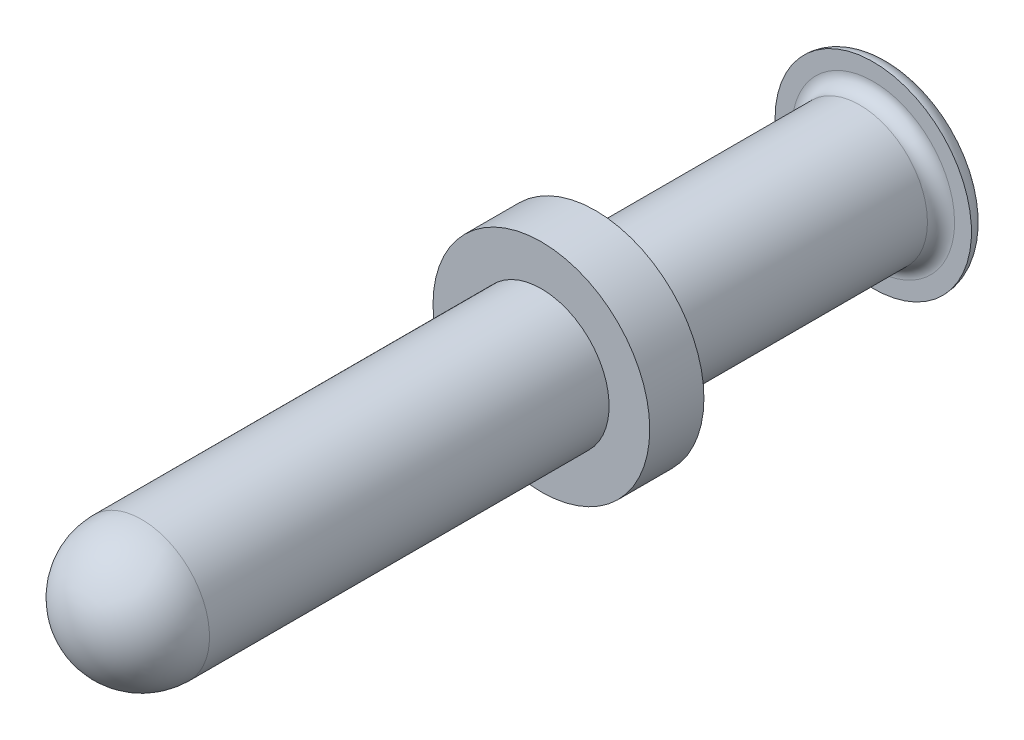
ISO-10303-21;
HEADER;
FILE_DESCRIPTION(('STEP AP214'),'2;1');
FILE_NAME('part.step','',(''),(''),'','','');
FILE_SCHEMA(('AUTOMOTIVE_DESIGN { 1 0 10303 214 1 1 1 1 }'));
ENDSEC;
DATA;
#1=APPLICATION_CONTEXT('core data for automotive mechanical design processes');
#2=APPLICATION_PROTOCOL_DEFINITION('international standard','automotive_design',2000,#1);
#3=PRODUCT_CONTEXT('',#1,'mechanical');
#4=PRODUCT('Part','Part','',(#3));
#5=PRODUCT_RELATED_PRODUCT_CATEGORY('part','',(#4));
#6=PRODUCT_DEFINITION_FORMATION('','',#4);
#7=PRODUCT_DEFINITION_CONTEXT('part definition',#1,'design');
#8=PRODUCT_DEFINITION('design','',#6,#7);
#9=PRODUCT_DEFINITION_SHAPE('','',#8);
#10=(LENGTH_UNIT() NAMED_UNIT(*) SI_UNIT(.MILLI.,.METRE.));
#11=(NAMED_UNIT(*) PLANE_ANGLE_UNIT() SI_UNIT($,.RADIAN.));
#12=(NAMED_UNIT(*) SI_UNIT($,.STERADIAN.) SOLID_ANGLE_UNIT());
#13=UNCERTAINTY_MEASURE_WITH_UNIT(LENGTH_MEASURE(1.E-05),#10,'distance_accuracy_value','');
#14=(GEOMETRIC_REPRESENTATION_CONTEXT(3) GLOBAL_UNCERTAINTY_ASSIGNED_CONTEXT((#13)) GLOBAL_UNIT_ASSIGNED_CONTEXT((#10,
#11,#12)) REPRESENTATION_CONTEXT('',''));
#15=CARTESIAN_POINT('',(0.,0.,0.));
#16=DIRECTION('',(0.,0.,1.));
#17=DIRECTION('',(1.,0.,0.));
#18=AXIS2_PLACEMENT_3D('',#15,#16,#17);
#19=CARTESIAN_POINT('',(0.,0.,-2.40000000002283));
#20=DIRECTION('',(0.,0.,-1.));
#21=DIRECTION('',(-1.,0.,0.));
#22=AXIS2_PLACEMENT_3D('',#19,#20,#21);
#23=CONICAL_SURFACE('',#22,0.749999999925421,1.05021549294806);
#24=CARTESIAN_POINT('',(5.6843418860808E-11,0.,-1.96999999971581));
#25=VERTEX_POINT('',#24);
#26=VERTEX_LOOP('',#25);
#27=FACE_BOUND('',#26,.T.);
#28=CARTESIAN_POINT('',(0.,0.,-2.4));
#29=DIRECTION('',(0.,0.,-1.));
#30=DIRECTION('',(-1.,0.,0.));
#31=AXIS2_PLACEMENT_3D('',#28,#29,#30);
#32=CIRCLE('',#31,0.75);
#33=CARTESIAN_POINT('',(-0.75,0.,-2.4));
#34=VERTEX_POINT('',#33);
#35=EDGE_CURVE('E44',#34,#34,#32,.T.);
#36=ORIENTED_EDGE('',*,*,#35,.T.);
#37=EDGE_LOOP('',(#36));
#38=FACE_BOUND('',#37,.T.);
#39=ADVANCED_FACE('F16',(#27,#38),#23,.F.);
#40=CARTESIAN_POINT('',(0.,0.,-3.9));
#41=DIRECTION('',(0.,0.,-1.));
#42=DIRECTION('',(-1.,0.,0.));
#43=AXIS2_PLACEMENT_3D('',#40,#41,#42);
#44=CYLINDRICAL_SURFACE('',#43,0.75);
#45=ORIENTED_EDGE('',*,*,#35,.F.);
#46=EDGE_LOOP('',(#45));
#47=FACE_BOUND('',#46,.T.);
#48=CARTESIAN_POINT('',(0.,0.,-3.9));
#49=DIRECTION('',(0.,0.,1.));
#50=DIRECTION('',(1.,0.,0.));
#51=AXIS2_PLACEMENT_3D('',#48,#49,#50);
#52=CIRCLE('',#51,0.75);
#53=CARTESIAN_POINT('',(0.75,0.,-3.9));
#54=VERTEX_POINT('',#53);
#55=EDGE_CURVE('E46',#54,#54,#52,.T.);
#56=ORIENTED_EDGE('',*,*,#55,.F.);
#57=EDGE_LOOP('',(#56));
#58=FACE_BOUND('',#57,.T.);
#59=ADVANCED_FACE('F40',(#47,#58),#44,.F.);
#60=CARTESIAN_POINT('',(0.,0.,-3.85000000000016));
#61=DIRECTION('',(0.,0.,1.));
#62=DIRECTION('',(1.,0.,0.));
#63=AXIS2_PLACEMENT_3D('',#60,#61,#62);
#64=TOROIDAL_SURFACE('',#63,1.24749371855334,0.500000000000079);
#65=CARTESIAN_POINT('',(0.,0.,-4.340910457157));
#66=DIRECTION('',(0.,0.,1.));
#67=DIRECTION('',(-1.,0.,0.));
#68=AXIS2_PLACEMENT_3D('',#65,#66,#67);
#69=CIRCLE('',#68,1.152588908063);
#70=CARTESIAN_POINT('',(-1.152588908063,0.,-4.340910457157));
#71=VERTEX_POINT('',#70);
#72=EDGE_CURVE('E49',#71,#71,#69,.T.);
#73=ORIENTED_EDGE('',*,*,#72,.F.);
#74=EDGE_LOOP('',(#73));
#75=FACE_BOUND('',#74,.T.);
#76=ORIENTED_EDGE('',*,*,#55,.T.);
#77=EDGE_LOOP('',(#76));
#78=FACE_BOUND('',#77,.T.);
#79=ADVANCED_FACE('F90',(#75,#78),#64,.T.);
#80=CARTESIAN_POINT('',(0.,0.,-4.09545522857772));
#81=DIRECTION('',(0.,0.,-1.));
#82=DIRECTION('',(-1.,0.,0.));
#83=AXIS2_PLACEMENT_3D('',#80,#81,#82);
#84=TOROIDAL_SURFACE('',#83,1.20004131330849,0.250000000000313);
#85=ORIENTED_EDGE('',*,*,#72,.T.);
#86=EDGE_LOOP('',(#85));
#87=FACE_BOUND('',#86,.T.);
#88=CARTESIAN_POINT('',(0.,0.,-4.10000000000001));
#89=DIRECTION('',(0.,0.,-1.));
#90=DIRECTION('',(-1.,0.,0.));
#91=AXIS2_PLACEMENT_3D('',#88,#89,#90);
#92=CIRCLE('',#91,1.45000000000066);
#93=CARTESIAN_POINT('',(-1.45000000000066,0.,-4.10000000000001));
#94=VERTEX_POINT('',#93);
#95=EDGE_CURVE('E20',#94,#94,#92,.T.);
#96=ORIENTED_EDGE('',*,*,#95,.T.);
#97=EDGE_LOOP('',(#96));
#98=FACE_BOUND('',#97,.T.);
#99=ADVANCED_FACE('F85',(#87,#98),#84,.T.);
#100=CARTESIAN_POINT('',(-1.2,0.,-4.1));
#101=DIRECTION('',(0.,0.,-1.));
#102=DIRECTION('',(-1.,0.,0.));
#103=AXIS2_PLACEMENT_3D('',#100,#101,#102);
#104=PLANE('',#103);
#105=CARTESIAN_POINT('',(1.2,0.,-4.1));
#106=CARTESIAN_POINT('',(1.2,0.228366044629868,-4.1));
#107=CARTESIAN_POINT('',(1.11574596127478,0.441713651474556,-4.1));
#108=CARTESIAN_POINT('',(1.0248346277536,0.671918823063507,-4.1));
#109=CARTESIAN_POINT('',(0.848528137423667,0.848528137423667,-4.1));
#110=CARTESIAN_POINT('',(0.673660893734094,1.02369573309341,-4.1));
#111=CARTESIAN_POINT('',(0.441713651474111,1.11574596127456,-4.1));
#112=CARTESIAN_POINT('',(0.229906911812743,1.19980326036621,-4.1));
#113=CARTESIAN_POINT('',(0.,1.20000000000033,-4.1));
#114=CARTESIAN_POINT('',(-0.227874939357829,1.20019500080236,-4.1));
#115=CARTESIAN_POINT('',(-0.441713651474444,1.11574596127511,-4.1));
#116=CARTESIAN_POINT('',(-0.671920707671893,1.02483274637664,-4.1));
#117=CARTESIAN_POINT('',(-0.848528137423667,0.848528137423667,-4.1));
#118=CARTESIAN_POINT('',(-1.02369573309332,0.673660893734214,-4.1));
#119=CARTESIAN_POINT('',(-1.11574596127456,0.441713651474111,-4.1));
#120=CARTESIAN_POINT('',(-1.2,0.229411169255753,-4.1));
#121=CARTESIAN_POINT('',(-1.2,0.,-4.1));
#122=B_SPLINE_CURVE_WITH_KNOTS('',2,(#105,#106,#107,#108,#109,#110,#111,#112,#113,#114,#115,
#116,#117,#118,#119,#120,#121),.UNSPECIFIED.,.F.,.F.,(3,2,2,2,2,2,2,2,3),(0.,0.125,0.25,0.375,
0.5,0.625,0.75,0.875,1.),.UNSPECIFIED.);
#123=CARTESIAN_POINT('',(-1.2,0.,-4.1));
#124=VERTEX_POINT('',#123);
#125=CARTESIAN_POINT('',(1.2,0.,-4.1));
#126=VERTEX_POINT('',#125);
#127=EDGE_CURVE('E67',#124,#126,#122,.F.);
#128=ORIENTED_EDGE('',*,*,#127,.T.);
#129=CARTESIAN_POINT('',(-1.2,0.,-4.1));
#130=CARTESIAN_POINT('',(-1.2,-0.228366044629746,-4.1));
#131=CARTESIAN_POINT('',(-1.11574596127478,-0.441713651474556,-4.1));
#132=CARTESIAN_POINT('',(-1.02483462775371,-0.671918823063378,-4.1));
#133=CARTESIAN_POINT('',(-0.848528137423667,-0.848528137423667,-4.1));
#134=CARTESIAN_POINT('',(-0.67366089373412,-1.02369573309341,-4.1));
#135=CARTESIAN_POINT('',(-0.441713651474111,-1.11574596127456,-4.1));
#136=CARTESIAN_POINT('',(-0.229906911812719,-1.19980326036621,-4.1));
#137=CARTESIAN_POINT('',(0.,-1.20000000000033,-4.1));
#138=CARTESIAN_POINT('',(0.227874939357877,-1.20019500080236,-4.1));
#139=CARTESIAN_POINT('',(0.441713651474444,-1.11574596127511,-4.1));
#140=CARTESIAN_POINT('',(0.671920707674766,-1.02483274637549,-4.1));
#141=CARTESIAN_POINT('',(0.848528137424333,-0.848528137423667,-4.1));
#142=CARTESIAN_POINT('',(1.02369573309357,-0.673660893733594,-4.1));
#143=CARTESIAN_POINT('',(1.11574596127456,-0.441713651474111,-4.1));
#144=CARTESIAN_POINT('',(1.2,-0.229411169255754,-4.1));
#145=CARTESIAN_POINT('',(1.2,0.,-4.1));
#146=B_SPLINE_CURVE_WITH_KNOTS('',2,(#129,#130,#131,#132,#133,#134,#135,#136,#137,#138,#139,
#140,#141,#142,#143,#144,#145),.UNSPECIFIED.,.F.,.F.,(3,2,2,2,2,2,2,2,3),(0.,0.125,0.25,0.375,
0.5,0.625,0.75,0.875,1.),.UNSPECIFIED.);
#147=EDGE_CURVE('E32',#126,#124,#146,.F.);
#148=ORIENTED_EDGE('',*,*,#147,.T.);
#149=EDGE_LOOP('',(#128,#148));
#150=FACE_BOUND('',#149,.T.);
#151=ORIENTED_EDGE('',*,*,#95,.F.);
#152=EDGE_LOOP('',(#151));
#153=FACE_BOUND('',#152,.T.);
#154=ADVANCED_FACE('F74',(#150,#153),#104,.F.);
#155=CARTESIAN_POINT('',(0.,0.,-3.9));
#156=DIRECTION('',(0.,0.,1.));
#157=DIRECTION('',(0.,-1.,0.));
#158=AXIS2_PLACEMENT_3D('',#155,#156,#157);
#159=TOROIDAL_SURFACE('',#158,1.2,0.2);
#160=ORIENTED_EDGE('',*,*,#147,.F.);
#161=ORIENTED_EDGE('',*,*,#127,.F.);
#162=EDGE_LOOP('',(#160,#161));
#163=FACE_BOUND('',#162,.T.);
#164=CARTESIAN_POINT('',(0.,0.,-3.9));
#165=DIRECTION('',(0.,0.,1.));
#166=DIRECTION('',(1.,0.,0.));
#167=AXIS2_PLACEMENT_3D('',#164,#165,#166);
#168=CIRCLE('',#167,1.);
#169=CARTESIAN_POINT('',(1.,0.,-3.9));
#170=VERTEX_POINT('',#169);
#171=EDGE_CURVE('E60',#170,#170,#168,.T.);
#172=ORIENTED_EDGE('',*,*,#171,.F.);
#173=EDGE_LOOP('',(#172));
#174=FACE_BOUND('',#173,.T.);
#175=ADVANCED_FACE('F84',(#163,#174),#159,.F.);
#176=CARTESIAN_POINT('',(0.,0.,-3.9));
#177=DIRECTION('',(0.,0.,1.));
#178=DIRECTION('',(1.,0.,0.));
#179=AXIS2_PLACEMENT_3D('',#176,#177,#178);
#180=CYLINDRICAL_SURFACE('',#179,1.);
#181=ORIENTED_EDGE('',*,*,#171,.T.);
#182=EDGE_LOOP('',(#181));
#183=FACE_BOUND('',#182,.T.);
#184=CARTESIAN_POINT('',(0.,0.,0.));
#185=DIRECTION('',(0.,0.,1.));
#186=DIRECTION('',(1.,0.,0.));
#187=AXIS2_PLACEMENT_3D('',#184,#185,#186);
#188=CIRCLE('',#187,1.);
#189=CARTESIAN_POINT('',(1.,0.,0.));
#190=VERTEX_POINT('',#189);
#191=EDGE_CURVE('E58',#190,#190,#188,.F.);
#192=ORIENTED_EDGE('',*,*,#191,.T.);
#193=EDGE_LOOP('',(#192));
#194=FACE_BOUND('',#193,.T.);
#195=ADVANCED_FACE('F86',(#183,#194),#180,.T.);
#196=CARTESIAN_POINT('',(0.,0.,0.));
#197=DIRECTION('',(0.,0.,1.));
#198=DIRECTION('',(1.,0.,0.));
#199=AXIS2_PLACEMENT_3D('',#196,#197,#198);
#200=PLANE('',#199);
#201=CARTESIAN_POINT('',(0.,0.,0.));
#202=DIRECTION('',(0.,0.,-1.));
#203=DIRECTION('',(-1.,0.,0.));
#204=AXIS2_PLACEMENT_3D('',#201,#202,#203);
#205=CIRCLE('',#204,1.6);
#206=CARTESIAN_POINT('',(-1.6,0.,0.));
#207=VERTEX_POINT('',#206);
#208=EDGE_CURVE('E56',#207,#207,#205,.F.);
#209=ORIENTED_EDGE('',*,*,#208,.F.);
#210=EDGE_LOOP('',(#209));
#211=FACE_BOUND('',#210,.T.);
#212=ORIENTED_EDGE('',*,*,#191,.F.);
#213=EDGE_LOOP('',(#212));
#214=FACE_BOUND('',#213,.T.);
#215=ADVANCED_FACE('F103',(#211,#214),#200,.F.);
#216=CARTESIAN_POINT('',(0.,0.,0.8));
#217=DIRECTION('',(0.,0.,-1.));
#218=DIRECTION('',(-1.,0.,0.));
#219=AXIS2_PLACEMENT_3D('',#216,#217,#218);
#220=CYLINDRICAL_SURFACE('',#219,1.6);
#221=ORIENTED_EDGE('',*,*,#208,.T.);
#222=EDGE_LOOP('',(#221));
#223=FACE_BOUND('',#222,.T.);
#224=CARTESIAN_POINT('',(0.,0.,0.8));
#225=DIRECTION('',(0.,0.,-1.));
#226=DIRECTION('',(-1.,0.,0.));
#227=AXIS2_PLACEMENT_3D('',#224,#225,#226);
#228=CIRCLE('',#227,1.6);
#229=CARTESIAN_POINT('',(-1.6,0.,0.8));
#230=VERTEX_POINT('',#229);
#231=EDGE_CURVE('E53',#230,#230,#228,.F.);
#232=ORIENTED_EDGE('',*,*,#231,.F.);
#233=EDGE_LOOP('',(#232));
#234=FACE_BOUND('',#233,.T.);
#235=ADVANCED_FACE('F117',(#223,#234),#220,.T.);
#236=CARTESIAN_POINT('',(0.,0.,6.7));
#237=DIRECTION('',(1.,0.,0.));
#238=DIRECTION('',(0.,-1.,0.));
#239=AXIS2_PLACEMENT_3D('',#236,#237,#238);
#240=SPHERICAL_SURFACE('',#239,1.);
#241=CARTESIAN_POINT('',(0.,0.,6.7));
#242=DIRECTION('',(0.,0.,-1.));
#243=DIRECTION('',(-1.,0.,0.));
#244=AXIS2_PLACEMENT_3D('',#241,#242,#243);
#245=SPHERICAL_SURFACE('',#244,1.);
#246=CARTESIAN_POINT('',(0.,0.,6.7));
#247=DIRECTION('',(0.,0.,-1.));
#248=DIRECTION('',(-1.,0.,0.));
#249=AXIS2_PLACEMENT_3D('',#246,#247,#248);
#250=CIRCLE('',#249,1.);
#251=CARTESIAN_POINT('',(-1.,0.,6.7));
#252=VERTEX_POINT('',#251);
#253=EDGE_CURVE('E26',#252,#252,#250,.T.);
#254=ORIENTED_EDGE('',*,*,#253,.F.);
#255=EDGE_LOOP('',(#254));
#256=FACE_BOUND('',#255,.T.);
#257=ADVANCED_FACE('F18',(#256),#245,.T.);
#258=CARTESIAN_POINT('',(0.,0.,0.8));
#259=DIRECTION('',(0.,0.,1.));
#260=DIRECTION('',(1.,0.,0.));
#261=AXIS2_PLACEMENT_3D('',#258,#259,#260);
#262=PLANE('',#261);
#263=ORIENTED_EDGE('',*,*,#231,.T.);
#264=EDGE_LOOP('',(#263));
#265=FACE_BOUND('',#264,.T.);
#266=CARTESIAN_POINT('',(0.,0.,0.8));
#267=DIRECTION('',(0.,0.,-1.));
#268=DIRECTION('',(-1.,0.,0.));
#269=AXIS2_PLACEMENT_3D('',#266,#267,#268);
#270=CIRCLE('',#269,1.);
#271=CARTESIAN_POINT('',(-1.,0.,0.8));
#272=VERTEX_POINT('',#271);
#273=EDGE_CURVE('E11',#272,#272,#270,.F.);
#274=ORIENTED_EDGE('',*,*,#273,.F.);
#275=EDGE_LOOP('',(#274));
#276=FACE_BOUND('',#275,.T.);
#277=ADVANCED_FACE('F107',(#265,#276),#262,.T.);
#278=CARTESIAN_POINT('',(0.,0.,7.7));
#279=DIRECTION('',(0.,0.,-1.));
#280=DIRECTION('',(-1.,0.,0.));
#281=AXIS2_PLACEMENT_3D('',#278,#279,#280);
#282=CYLINDRICAL_SURFACE('',#281,1.);
#283=ORIENTED_EDGE('',*,*,#273,.T.);
#284=EDGE_LOOP('',(#283));
#285=FACE_BOUND('',#284,.T.);
#286=ORIENTED_EDGE('',*,*,#253,.T.);
#287=EDGE_LOOP('',(#286));
#288=FACE_BOUND('',#287,.T.);
#289=ADVANCED_FACE('F105',(#285,#288),#282,.T.);
#290=CLOSED_SHELL('',(#39,#59,#79,#99,#154,#175,#195,#215,#235,#257,#277,#289));
#291=MANIFOLD_SOLID_BREP('B1',#290);
#292=ADVANCED_BREP_SHAPE_REPRESENTATION('',(#18,#291),#14);
#293=SHAPE_DEFINITION_REPRESENTATION(#9,#292);
ENDSEC;
END-ISO-10303-21;
